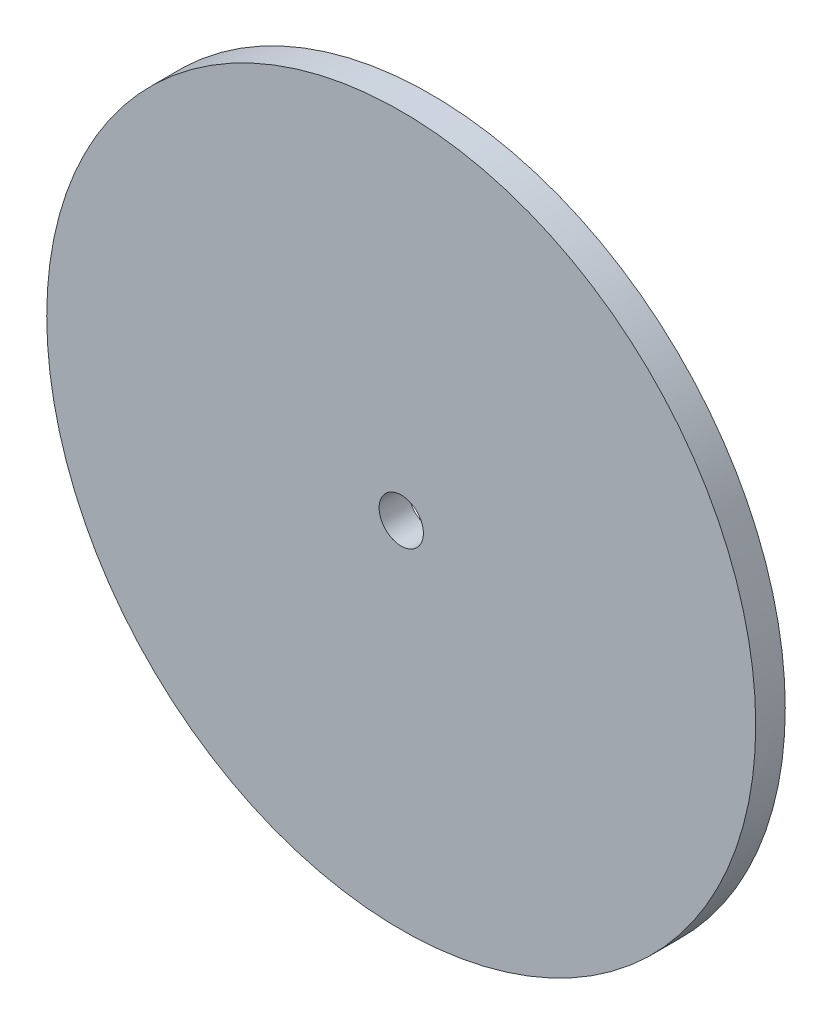
ISO-10303-21;
HEADER;
FILE_DESCRIPTION(('STEP AP214'),'2;1');
FILE_NAME('part.step','',(''),(''),'','','');
FILE_SCHEMA(('AUTOMOTIVE_DESIGN { 1 0 10303 214 1 1 1 1 }'));
ENDSEC;
DATA;
#1=APPLICATION_CONTEXT('core data for automotive mechanical design processes');
#2=APPLICATION_PROTOCOL_DEFINITION('international standard','automotive_design',2000,#1);
#3=PRODUCT_CONTEXT('',#1,'mechanical');
#4=PRODUCT('Part','Part','',(#3));
#5=PRODUCT_RELATED_PRODUCT_CATEGORY('part','',(#4));
#6=PRODUCT_DEFINITION_FORMATION('','',#4);
#7=PRODUCT_DEFINITION_CONTEXT('part definition',#1,'design');
#8=PRODUCT_DEFINITION('design','',#6,#7);
#9=PRODUCT_DEFINITION_SHAPE('','',#8);
#10=(LENGTH_UNIT() NAMED_UNIT(*) SI_UNIT(.MILLI.,.METRE.));
#11=(NAMED_UNIT(*) PLANE_ANGLE_UNIT() SI_UNIT($,.RADIAN.));
#12=(NAMED_UNIT(*) SI_UNIT($,.STERADIAN.) SOLID_ANGLE_UNIT());
#13=UNCERTAINTY_MEASURE_WITH_UNIT(LENGTH_MEASURE(1.E-05),#10,'distance_accuracy_value','');
#14=(GEOMETRIC_REPRESENTATION_CONTEXT(3) GLOBAL_UNCERTAINTY_ASSIGNED_CONTEXT((#13)) GLOBAL_UNIT_ASSIGNED_CONTEXT((#10,
#11,#12)) REPRESENTATION_CONTEXT('',''));
#15=CARTESIAN_POINT('',(0.,0.,0.));
#16=DIRECTION('',(0.,0.,1.));
#17=DIRECTION('',(1.,0.,0.));
#18=AXIS2_PLACEMENT_3D('',#15,#16,#17);
#19=CARTESIAN_POINT('',(0.,0.,6.35));
#20=DIRECTION('',(0.,0.,-1.));
#21=DIRECTION('',(-1.,0.,0.));
#22=AXIS2_PLACEMENT_3D('',#19,#20,#21);
#23=CYLINDRICAL_SURFACE('',#22,76.2);
#24=CARTESIAN_POINT('',(0.,0.,6.35));
#25=DIRECTION('',(0.,0.,1.));
#26=DIRECTION('',(1.,0.,0.));
#27=AXIS2_PLACEMENT_3D('',#24,#25,#26);
#28=CIRCLE('',#27,76.2);
#29=CARTESIAN_POINT('',(76.2,0.,6.35));
#30=VERTEX_POINT('',#29);
#31=EDGE_CURVE('E10',#30,#30,#28,.T.);
#32=ORIENTED_EDGE('',*,*,#31,.F.);
#33=EDGE_LOOP('',(#32));
#34=FACE_BOUND('',#33,.T.);
#35=CARTESIAN_POINT('',(0.,0.,0.));
#36=DIRECTION('',(0.,0.,1.));
#37=DIRECTION('',(1.,0.,0.));
#38=AXIS2_PLACEMENT_3D('',#35,#36,#37);
#39=CIRCLE('',#38,76.2);
#40=CARTESIAN_POINT('',(76.2,0.,0.));
#41=VERTEX_POINT('',#40);
#42=EDGE_CURVE('E37',#41,#41,#39,.T.);
#43=ORIENTED_EDGE('',*,*,#42,.T.);
#44=EDGE_LOOP('',(#43));
#45=FACE_BOUND('',#44,.T.);
#46=ADVANCED_FACE('F30',(#34,#45),#23,.T.);
#47=CARTESIAN_POINT('',(0.,0.,6.35));
#48=DIRECTION('',(0.,0.,1.));
#49=DIRECTION('',(1.,0.,0.));
#50=AXIS2_PLACEMENT_3D('',#47,#48,#49);
#51=PLANE('',#50);
#52=CARTESIAN_POINT('',(0.,0.,6.35));
#53=DIRECTION('',(0.,0.,1.));
#54=DIRECTION('',(1.,0.,0.));
#55=AXIS2_PLACEMENT_3D('',#52,#53,#54);
#56=CIRCLE('',#55,4.7625);
#57=CARTESIAN_POINT('',(4.7625,0.,6.35));
#58=VERTEX_POINT('',#57);
#59=EDGE_CURVE('E43',#58,#58,#56,.T.);
#60=ORIENTED_EDGE('',*,*,#59,.F.);
#61=EDGE_LOOP('',(#60));
#62=FACE_BOUND('',#61,.T.);
#63=ORIENTED_EDGE('',*,*,#31,.T.);
#64=EDGE_LOOP('',(#63));
#65=FACE_BOUND('',#64,.T.);
#66=ADVANCED_FACE('F72',(#62,#65),#51,.T.);
#67=CARTESIAN_POINT('',(0.,0.,0.));
#68=DIRECTION('',(0.,0.,1.));
#69=DIRECTION('',(1.,0.,0.));
#70=AXIS2_PLACEMENT_3D('',#67,#68,#69);
#71=PLANE('',#70);
#72=CARTESIAN_POINT('',(0.,-63.5,0.));
#73=DIRECTION('',(0.,0.,-1.));
#74=DIRECTION('',(-1.,0.,0.));
#75=AXIS2_PLACEMENT_3D('',#72,#73,#74);
#76=CIRCLE('',#75,3.175);
#77=CARTESIAN_POINT('',(-3.17500000000001,-63.5,0.));
#78=VERTEX_POINT('',#77);
#79=EDGE_CURVE('E53',#78,#78,#76,.T.);
#80=ORIENTED_EDGE('',*,*,#79,.F.);
#81=EDGE_LOOP('',(#80));
#82=FACE_BOUND('',#81,.T.);
#83=CARTESIAN_POINT('',(0.,63.5,0.));
#84=DIRECTION('',(0.,0.,-1.));
#85=DIRECTION('',(-1.,0.,0.));
#86=AXIS2_PLACEMENT_3D('',#83,#84,#85);
#87=CIRCLE('',#86,3.175);
#88=CARTESIAN_POINT('',(-3.175,63.5,0.));
#89=VERTEX_POINT('',#88);
#90=EDGE_CURVE('E50',#89,#89,#87,.T.);
#91=ORIENTED_EDGE('',*,*,#90,.F.);
#92=EDGE_LOOP('',(#91));
#93=FACE_BOUND('',#92,.T.);
#94=CARTESIAN_POINT('',(0.,0.,0.));
#95=DIRECTION('',(0.,0.,1.));
#96=DIRECTION('',(1.,0.,0.));
#97=AXIS2_PLACEMENT_3D('',#94,#95,#96);
#98=CIRCLE('',#97,4.7625);
#99=CARTESIAN_POINT('',(4.7625,0.,0.));
#100=VERTEX_POINT('',#99);
#101=EDGE_CURVE('E33',#100,#100,#98,.T.);
#102=ORIENTED_EDGE('',*,*,#101,.T.);
#103=EDGE_LOOP('',(#102));
#104=FACE_BOUND('',#103,.T.);
#105=ORIENTED_EDGE('',*,*,#42,.F.);
#106=EDGE_LOOP('',(#105));
#107=FACE_BOUND('',#106,.T.);
#108=ADVANCED_FACE('F68',(#82,#93,#104,#107),#71,.F.);
#109=CARTESIAN_POINT('',(0.,0.,-1.2E-05));
#110=DIRECTION('',(0.,0.,1.));
#111=DIRECTION('',(1.,0.,0.));
#112=AXIS2_PLACEMENT_3D('',#109,#110,#111);
#113=CYLINDRICAL_SURFACE('',#112,4.7625);
#114=CARTESIAN_POINT('',(4.7625,0.,6.35));
#115=CARTESIAN_POINT('',(4.7625,0.,6.28385416666667));
#116=CARTESIAN_POINT('',(4.7625,0.,6.21770833333333));
#117=CARTESIAN_POINT('',(4.7625,0.,6.08541666666667));
#118=CARTESIAN_POINT('',(4.7625,0.,6.01927083333333));
#119=CARTESIAN_POINT('',(4.7625,0.,5.88697916666667));
#120=CARTESIAN_POINT('',(4.7625,0.,5.82083333333333));
#121=CARTESIAN_POINT('',(4.7625,0.,5.68854166666667));
#122=CARTESIAN_POINT('',(4.7625,0.,5.62239583333333));
#123=CARTESIAN_POINT('',(4.7625,0.,5.49010416666667));
#124=CARTESIAN_POINT('',(4.7625,0.,5.42395833333333));
#125=CARTESIAN_POINT('',(4.7625,0.,5.29166666666667));
#126=CARTESIAN_POINT('',(4.7625,0.,5.22552083333333));
#127=CARTESIAN_POINT('',(4.7625,0.,5.09322916666667));
#128=CARTESIAN_POINT('',(4.7625,0.,5.02708333333333));
#129=CARTESIAN_POINT('',(4.7625,0.,4.89479166666667));
#130=CARTESIAN_POINT('',(4.7625,0.,4.82864583333333));
#131=CARTESIAN_POINT('',(4.7625,0.,4.69635416666667));
#132=CARTESIAN_POINT('',(4.7625,0.,4.63020833333333));
#133=CARTESIAN_POINT('',(4.7625,0.,4.49791666666667));
#134=CARTESIAN_POINT('',(4.7625,0.,4.43177083333333));
#135=CARTESIAN_POINT('',(4.7625,0.,4.29947916666667));
#136=CARTESIAN_POINT('',(4.7625,0.,4.23333333333333));
#137=CARTESIAN_POINT('',(4.7625,0.,4.10104166666667));
#138=CARTESIAN_POINT('',(4.7625,0.,4.03489583333333));
#139=CARTESIAN_POINT('',(4.7625,0.,3.90260416666667));
#140=CARTESIAN_POINT('',(4.7625,0.,3.83645833333333));
#141=CARTESIAN_POINT('',(4.7625,0.,3.70416666666667));
#142=CARTESIAN_POINT('',(4.7625,0.,3.63802083333333));
#143=CARTESIAN_POINT('',(4.7625,0.,3.50572916666667));
#144=CARTESIAN_POINT('',(4.7625,0.,3.43958333333333));
#145=CARTESIAN_POINT('',(4.7625,0.,3.30729166666667));
#146=CARTESIAN_POINT('',(4.7625,0.,3.24114583333333));
#147=CARTESIAN_POINT('',(4.7625,0.,3.10885416666667));
#148=CARTESIAN_POINT('',(4.7625,0.,3.04270833333333));
#149=CARTESIAN_POINT('',(4.7625,0.,2.91041666666667));
#150=CARTESIAN_POINT('',(4.7625,0.,2.84427083333333));
#151=CARTESIAN_POINT('',(4.7625,0.,2.71197916666667));
#152=CARTESIAN_POINT('',(4.7625,0.,2.64583333333333));
#153=CARTESIAN_POINT('',(4.7625,0.,2.51354166666667));
#154=CARTESIAN_POINT('',(4.7625,0.,2.44739583333333));
#155=CARTESIAN_POINT('',(4.7625,0.,2.31510416666667));
#156=CARTESIAN_POINT('',(4.7625,0.,2.24895833333333));
#157=CARTESIAN_POINT('',(4.7625,0.,2.11666666666667));
#158=CARTESIAN_POINT('',(4.7625,0.,2.05052083333333));
#159=CARTESIAN_POINT('',(4.7625,0.,1.91822916666667));
#160=CARTESIAN_POINT('',(4.7625,0.,1.85208333333333));
#161=CARTESIAN_POINT('',(4.7625,0.,1.71979166666667));
#162=CARTESIAN_POINT('',(4.7625,0.,1.65364583333333));
#163=CARTESIAN_POINT('',(4.7625,0.,1.52135416666667));
#164=CARTESIAN_POINT('',(4.7625,0.,1.45520833333333));
#165=CARTESIAN_POINT('',(4.7625,0.,1.32291666666667));
#166=CARTESIAN_POINT('',(4.7625,0.,1.25677083333333));
#167=CARTESIAN_POINT('',(4.7625,0.,1.12447916666667));
#168=CARTESIAN_POINT('',(4.7625,0.,1.05833333333333));
#169=CARTESIAN_POINT('',(4.7625,0.,0.926041666666666));
#170=CARTESIAN_POINT('',(4.7625,0.,0.859895833333333));
#171=CARTESIAN_POINT('',(4.7625,0.,0.727604166666666));
#172=CARTESIAN_POINT('',(4.7625,0.,0.661458333333333));
#173=CARTESIAN_POINT('',(4.7625,0.,0.529166666666666));
#174=CARTESIAN_POINT('',(4.7625,0.,0.463020833333333));
#175=CARTESIAN_POINT('',(4.7625,0.,0.330729166666666));
#176=CARTESIAN_POINT('',(4.7625,0.,0.264583333333333));
#177=CARTESIAN_POINT('',(4.7625,0.,0.132291666666666));
#178=CARTESIAN_POINT('',(4.7625,0.,0.066145833333333));
#179=CARTESIAN_POINT('',(4.7625,0.,0.));
#180=B_SPLINE_CURVE_WITH_KNOTS('',3,(#114,#115,#116,#117,#118,#119,#120,#121,#122,#123,#124,
#125,#126,#127,#128,#129,#130,#131,#132,#133,#134,#135,#136,#137,#138,#139,#140,#141,#142,#143,
#144,#145,#146,#147,#148,#149,#150,#151,#152,#153,#154,#155,#156,#157,#158,#159,#160,#161,#162,
#163,#164,#165,#166,#167,#168,#169,#170,#171,#172,#173,#174,#175,#176,#177,#178,#179),
.UNSPECIFIED.,.F.,.F.,(4,2,2,2,2,2,2,2,2,2,2,2,2,2,2,2,2,2,2,2,2,2,2,2,2,2,2,2,2,2,2,2,4),(0.,
0.1984375,0.396875,0.5953125,0.79375,0.9921875,1.190625,1.3890625,1.5875,1.7859375,1.984375,
2.1828125,2.38125,2.5796875,2.778125,2.9765625,3.175,3.3734375,3.571875,3.7703125,3.96875,
4.1671875,4.365625,4.5640625,4.7625,4.9609375,5.159375,5.3578125,5.55625,5.7546875,5.953125,
6.1515625,6.35),.UNSPECIFIED.);
#181=EDGE_CURVE('BSEAM71',#58,#100,#180,.T.);
#182=ORIENTED_EDGE('',*,*,#59,.T.);
#183=ORIENTED_EDGE('',*,*,#101,.F.);
#184=ORIENTED_EDGE('',*,*,#181,.T.);
#185=ORIENTED_EDGE('',*,*,#181,.F.);
#186=EDGE_LOOP('',(#182,#184,#183,#185));
#187=FACE_BOUND('',#186,.T.);
#188=ADVANCED_FACE('F71',(#187),#113,.F.);
#189=CARTESIAN_POINT('',(0.,63.5,3.175));
#190=DIRECTION('',(0.,0.,-1.));
#191=DIRECTION('',(-1.,0.,0.));
#192=AXIS2_PLACEMENT_3D('',#189,#190,#191);
#193=CYLINDRICAL_SURFACE('',#192,3.175);
#194=CARTESIAN_POINT('',(0.,63.5,3.175));
#195=DIRECTION('',(0.,0.,-1.));
#196=DIRECTION('',(-1.,0.,0.));
#197=AXIS2_PLACEMENT_3D('',#194,#195,#196);
#198=CIRCLE('',#197,3.175);
#199=CARTESIAN_POINT('',(-3.175,63.5,3.175));
#200=VERTEX_POINT('',#199);
#201=EDGE_CURVE('E47',#200,#200,#198,.T.);
#202=ORIENTED_EDGE('',*,*,#201,.F.);
#203=EDGE_LOOP('',(#202));
#204=FACE_BOUND('',#203,.T.);
#205=ORIENTED_EDGE('',*,*,#90,.T.);
#206=EDGE_LOOP('',(#205));
#207=FACE_BOUND('',#206,.T.);
#208=ADVANCED_FACE('F93',(#204,#207),#193,.F.);
#209=CARTESIAN_POINT('',(0.,63.5,3.175));
#210=DIRECTION('',(0.,0.,-1.));
#211=DIRECTION('',(-1.,0.,0.));
#212=AXIS2_PLACEMENT_3D('',#209,#210,#211);
#213=PLANE('',#212);
#214=ORIENTED_EDGE('',*,*,#201,.T.);
#215=EDGE_LOOP('',(#214));
#216=FACE_BOUND('',#215,.T.);
#217=ADVANCED_FACE('F64',(#216),#213,.T.);
#218=CARTESIAN_POINT('',(0.,-63.5,3.175));
#219=DIRECTION('',(0.,0.,-1.));
#220=DIRECTION('',(-1.,0.,0.));
#221=AXIS2_PLACEMENT_3D('',#218,#219,#220);
#222=CYLINDRICAL_SURFACE('',#221,3.175);
#223=CARTESIAN_POINT('',(0.,-63.5,3.175));
#224=DIRECTION('',(0.,0.,-1.));
#225=DIRECTION('',(-1.,0.,0.));
#226=AXIS2_PLACEMENT_3D('',#223,#224,#225);
#227=CIRCLE('',#226,3.175);
#228=CARTESIAN_POINT('',(-3.17500000000001,-63.5,3.175));
#229=VERTEX_POINT('',#228);
#230=EDGE_CURVE('E46',#229,#229,#227,.T.);
#231=ORIENTED_EDGE('',*,*,#230,.F.);
#232=EDGE_LOOP('',(#231));
#233=FACE_BOUND('',#232,.T.);
#234=ORIENTED_EDGE('',*,*,#79,.T.);
#235=EDGE_LOOP('',(#234));
#236=FACE_BOUND('',#235,.T.);
#237=ADVANCED_FACE('F61',(#233,#236),#222,.F.);
#238=CARTESIAN_POINT('',(0.,-63.5,3.175));
#239=DIRECTION('',(0.,0.,-1.));
#240=DIRECTION('',(-1.,0.,0.));
#241=AXIS2_PLACEMENT_3D('',#238,#239,#240);
#242=PLANE('',#241);
#243=ORIENTED_EDGE('',*,*,#230,.T.);
#244=EDGE_LOOP('',(#243));
#245=FACE_BOUND('',#244,.T.);
#246=ADVANCED_FACE('F59',(#245),#242,.T.);
#247=CLOSED_SHELL('',(#46,#66,#108,#188,#208,#217,#237,#246));
#248=MANIFOLD_SOLID_BREP('B2',#247);
#249=ADVANCED_BREP_SHAPE_REPRESENTATION('',(#18,#248),#14);
#250=SHAPE_DEFINITION_REPRESENTATION(#9,#249);
ENDSEC;
END-ISO-10303-21;
